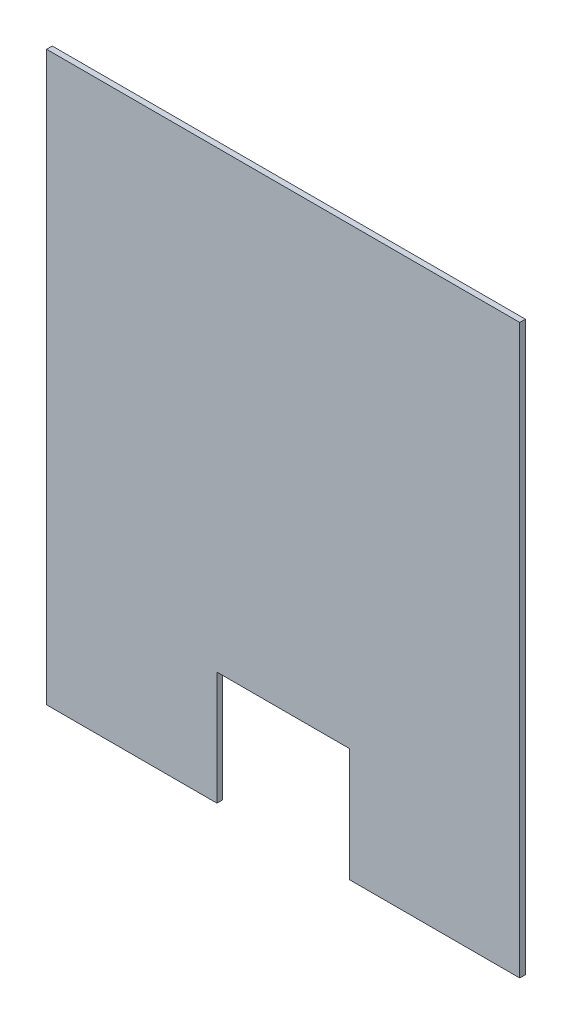
ISO-10303-21;
HEADER;
FILE_DESCRIPTION(('STEP AP214'),'2;1');
FILE_NAME('part.step','',(''),(''),'','','');
FILE_SCHEMA(('AUTOMOTIVE_DESIGN { 1 0 10303 214 1 1 1 1 }'));
ENDSEC;
DATA;
#1=APPLICATION_CONTEXT('core data for automotive mechanical design processes');
#2=APPLICATION_PROTOCOL_DEFINITION('international standard','automotive_design',2000,#1);
#3=PRODUCT_CONTEXT('',#1,'mechanical');
#4=PRODUCT('Part','Part','',(#3));
#5=PRODUCT_RELATED_PRODUCT_CATEGORY('part','',(#4));
#6=PRODUCT_DEFINITION_FORMATION('','',#4);
#7=PRODUCT_DEFINITION_CONTEXT('part definition',#1,'design');
#8=PRODUCT_DEFINITION('design','',#6,#7);
#9=PRODUCT_DEFINITION_SHAPE('','',#8);
#10=(LENGTH_UNIT() NAMED_UNIT(*) SI_UNIT(.MILLI.,.METRE.));
#11=(NAMED_UNIT(*) PLANE_ANGLE_UNIT() SI_UNIT($,.RADIAN.));
#12=(NAMED_UNIT(*) SI_UNIT($,.STERADIAN.) SOLID_ANGLE_UNIT());
#13=UNCERTAINTY_MEASURE_WITH_UNIT(LENGTH_MEASURE(1.E-05),#10,'distance_accuracy_value','');
#14=(GEOMETRIC_REPRESENTATION_CONTEXT(3) GLOBAL_UNCERTAINTY_ASSIGNED_CONTEXT((#13)) GLOBAL_UNIT_ASSIGNED_CONTEXT((#10,
#11,#12)) REPRESENTATION_CONTEXT('',''));
#15=CARTESIAN_POINT('',(0.,0.,0.));
#16=DIRECTION('',(0.,0.,1.));
#17=DIRECTION('',(1.,0.,0.));
#18=AXIS2_PLACEMENT_3D('',#15,#16,#17);
#19=CARTESIAN_POINT('',(125.,-150.,3.));
#20=DIRECTION('',(-1.,0.,0.));
#21=DIRECTION('',(0.,0.,1.));
#22=AXIS2_PLACEMENT_3D('',#19,#20,#21);
#23=PLANE('',#22);
#24=DIRECTION('',(0.,1.,0.));
#25=VECTOR('',#24,1.);
#26=CARTESIAN_POINT('',(125.,-150.,0.));
#27=LINE('',#26,#25);
#28=CARTESIAN_POINT('',(125.,-150.,0.));
#29=VERTEX_POINT('',#28);
#30=CARTESIAN_POINT('',(125.,150.,0.));
#31=VERTEX_POINT('',#30);
#32=EDGE_CURVE('E129',#29,#31,#27,.T.);
#33=ORIENTED_EDGE('',*,*,#32,.T.);
#34=DIRECTION('',(0.,0.,-1.));
#35=VECTOR('',#34,1.);
#36=CARTESIAN_POINT('',(125.,150.,3.));
#37=LINE('',#36,#35);
#38=CARTESIAN_POINT('',(125.,150.,3.));
#39=VERTEX_POINT('',#38);
#40=EDGE_CURVE('E11',#39,#31,#37,.T.);
#41=ORIENTED_EDGE('',*,*,#40,.F.);
#42=DIRECTION('',(0.,1.,0.));
#43=VECTOR('',#42,1.);
#44=CARTESIAN_POINT('',(125.,-150.,3.));
#45=LINE('',#44,#43);
#46=CARTESIAN_POINT('',(125.,-150.,3.));
#47=VERTEX_POINT('',#46);
#48=EDGE_CURVE('E143',#47,#39,#45,.T.);
#49=ORIENTED_EDGE('',*,*,#48,.F.);
#50=DIRECTION('',(0.,0.,-1.));
#51=VECTOR('',#50,1.);
#52=CARTESIAN_POINT('',(125.,-150.,3.));
#53=LINE('',#52,#51);
#54=EDGE_CURVE('E125',#47,#29,#53,.T.);
#55=ORIENTED_EDGE('',*,*,#54,.T.);
#56=EDGE_LOOP('',(#33,#41,#49,#55));
#57=FACE_BOUND('',#56,.T.);
#58=ADVANCED_FACE('F33',(#57),#23,.F.);
#59=CARTESIAN_POINT('',(-125.,150.,3.));
#60=DIRECTION('',(0.,-1.,0.));
#61=DIRECTION('',(0.,0.,-1.));
#62=AXIS2_PLACEMENT_3D('',#59,#60,#61);
#63=PLANE('',#62);
#64=DIRECTION('',(-1.,0.,0.));
#65=VECTOR('',#64,1.);
#66=CARTESIAN_POINT('',(-125.,150.,0.));
#67=LINE('',#66,#65);
#68=CARTESIAN_POINT('',(-125.,150.,0.));
#69=VERTEX_POINT('',#68);
#70=EDGE_CURVE('E132',#31,#69,#67,.T.);
#71=ORIENTED_EDGE('',*,*,#70,.T.);
#72=DIRECTION('',(0.,0.,-1.));
#73=VECTOR('',#72,1.);
#74=CARTESIAN_POINT('',(-125.,150.,3.));
#75=LINE('',#74,#73);
#76=CARTESIAN_POINT('',(-125.,150.,3.));
#77=VERTEX_POINT('',#76);
#78=EDGE_CURVE('E41',#77,#69,#75,.T.);
#79=ORIENTED_EDGE('',*,*,#78,.F.);
#80=DIRECTION('',(-1.,0.,0.));
#81=VECTOR('',#80,1.);
#82=CARTESIAN_POINT('',(-125.,150.,3.));
#83=LINE('',#82,#81);
#84=EDGE_CURVE('E92',#39,#77,#83,.T.);
#85=ORIENTED_EDGE('',*,*,#84,.F.);
#86=ORIENTED_EDGE('',*,*,#40,.T.);
#87=EDGE_LOOP('',(#71,#79,#85,#86));
#88=FACE_BOUND('',#87,.T.);
#89=ADVANCED_FACE('F178',(#88),#63,.F.);
#90=CARTESIAN_POINT('',(-125.,-150.,3.));
#91=DIRECTION('',(1.,0.,0.));
#92=DIRECTION('',(0.,0.,-1.));
#93=AXIS2_PLACEMENT_3D('',#90,#91,#92);
#94=PLANE('',#93);
#95=DIRECTION('',(0.,-1.,0.));
#96=VECTOR('',#95,1.);
#97=CARTESIAN_POINT('',(-125.,-150.,0.));
#98=LINE('',#97,#96);
#99=CARTESIAN_POINT('',(-125.,-150.,0.));
#100=VERTEX_POINT('',#99);
#101=EDGE_CURVE('E134',#69,#100,#98,.T.);
#102=ORIENTED_EDGE('',*,*,#101,.T.);
#103=DIRECTION('',(0.,0.,-1.));
#104=VECTOR('',#103,1.);
#105=CARTESIAN_POINT('',(-125.,-150.,3.));
#106=LINE('',#105,#104);
#107=CARTESIAN_POINT('',(-125.,-150.,3.));
#108=VERTEX_POINT('',#107);
#109=EDGE_CURVE('E150',#108,#100,#106,.T.);
#110=ORIENTED_EDGE('',*,*,#109,.F.);
#111=DIRECTION('',(0.,-1.,0.));
#112=VECTOR('',#111,1.);
#113=CARTESIAN_POINT('',(-125.,-150.,3.));
#114=LINE('',#113,#112);
#115=EDGE_CURVE('E158',#77,#108,#114,.T.);
#116=ORIENTED_EDGE('',*,*,#115,.F.);
#117=ORIENTED_EDGE('',*,*,#78,.T.);
#118=EDGE_LOOP('',(#102,#110,#116,#117));
#119=FACE_BOUND('',#118,.T.);
#120=ADVANCED_FACE('F156',(#119),#94,.F.);
#121=CARTESIAN_POINT('',(-125.,-150.,3.));
#122=DIRECTION('',(0.,1.,0.));
#123=DIRECTION('',(0.,0.,1.));
#124=AXIS2_PLACEMENT_3D('',#121,#122,#123);
#125=PLANE('',#124);
#126=DIRECTION('',(1.,0.,0.));
#127=VECTOR('',#126,1.);
#128=CARTESIAN_POINT('',(-125.,-150.,0.));
#129=LINE('',#128,#127);
#130=CARTESIAN_POINT('',(-35.,-150.,0.));
#131=VERTEX_POINT('',#130);
#132=EDGE_CURVE('E136',#100,#131,#129,.T.);
#133=ORIENTED_EDGE('',*,*,#132,.T.);
#134=DIRECTION('',(0.,0.,-1.));
#135=VECTOR('',#134,1.);
#136=CARTESIAN_POINT('',(-35.,-150.,3.));
#137=LINE('',#136,#135);
#138=CARTESIAN_POINT('',(-35.,-150.,3.));
#139=VERTEX_POINT('',#138);
#140=EDGE_CURVE('E147',#139,#131,#137,.T.);
#141=ORIENTED_EDGE('',*,*,#140,.F.);
#142=DIRECTION('',(1.,0.,0.));
#143=VECTOR('',#142,1.);
#144=CARTESIAN_POINT('',(-125.,-150.,3.));
#145=LINE('',#144,#143);
#146=EDGE_CURVE('E170',#108,#139,#145,.T.);
#147=ORIENTED_EDGE('',*,*,#146,.F.);
#148=ORIENTED_EDGE('',*,*,#109,.T.);
#149=EDGE_LOOP('',(#133,#141,#147,#148));
#150=FACE_BOUND('',#149,.T.);
#151=ADVANCED_FACE('F166',(#150),#125,.F.);
#152=CARTESIAN_POINT('',(-35.,-150.,3.));
#153=DIRECTION('',(-1.,0.,0.));
#154=DIRECTION('',(0.,-1.,0.));
#155=AXIS2_PLACEMENT_3D('',#152,#153,#154);
#156=PLANE('',#155);
#157=DIRECTION('',(0.,1.,0.));
#158=VECTOR('',#157,1.);
#159=CARTESIAN_POINT('',(-35.,-150.,0.));
#160=LINE('',#159,#158);
#161=CARTESIAN_POINT('',(-35.,-90.0000000000002,0.));
#162=VERTEX_POINT('',#161);
#163=EDGE_CURVE('E138',#131,#162,#160,.T.);
#164=ORIENTED_EDGE('',*,*,#163,.T.);
#165=DIRECTION('',(0.,0.,-1.));
#166=VECTOR('',#165,1.);
#167=CARTESIAN_POINT('',(-35.,-90.0000000000002,3.));
#168=LINE('',#167,#166);
#169=CARTESIAN_POINT('',(-35.,-90.0000000000002,3.));
#170=VERTEX_POINT('',#169);
#171=EDGE_CURVE('E120',#170,#162,#168,.T.);
#172=ORIENTED_EDGE('',*,*,#171,.F.);
#173=DIRECTION('',(0.,1.,0.));
#174=VECTOR('',#173,1.);
#175=CARTESIAN_POINT('',(-35.,-150.,3.));
#176=LINE('',#175,#174);
#177=EDGE_CURVE('E111',#139,#170,#176,.T.);
#178=ORIENTED_EDGE('',*,*,#177,.F.);
#179=ORIENTED_EDGE('',*,*,#140,.T.);
#180=EDGE_LOOP('',(#164,#172,#178,#179));
#181=FACE_BOUND('',#180,.T.);
#182=ADVANCED_FACE('F169',(#181),#156,.F.);
#183=CARTESIAN_POINT('',(-35.,-90.0000000000002,3.));
#184=DIRECTION('',(0.,1.,0.));
#185=DIRECTION('',(0.,0.,1.));
#186=AXIS2_PLACEMENT_3D('',#183,#184,#185);
#187=PLANE('',#186);
#188=DIRECTION('',(1.,0.,0.));
#189=VECTOR('',#188,1.);
#190=CARTESIAN_POINT('',(-35.,-90.0000000000002,0.));
#191=LINE('',#190,#189);
#192=CARTESIAN_POINT('',(35.,-90.0000000000002,0.));
#193=VERTEX_POINT('',#192);
#194=EDGE_CURVE('E119',#162,#193,#191,.T.);
#195=ORIENTED_EDGE('',*,*,#194,.T.);
#196=DIRECTION('',(0.,0.,-1.));
#197=VECTOR('',#196,1.);
#198=CARTESIAN_POINT('',(35.,-90.0000000000002,3.));
#199=LINE('',#198,#197);
#200=CARTESIAN_POINT('',(35.,-90.0000000000002,3.));
#201=VERTEX_POINT('',#200);
#202=EDGE_CURVE('E116',#201,#193,#199,.T.);
#203=ORIENTED_EDGE('',*,*,#202,.F.);
#204=DIRECTION('',(1.,0.,0.));
#205=VECTOR('',#204,1.);
#206=CARTESIAN_POINT('',(-35.,-90.0000000000002,3.));
#207=LINE('',#206,#205);
#208=EDGE_CURVE('E105',#170,#201,#207,.T.);
#209=ORIENTED_EDGE('',*,*,#208,.F.);
#210=ORIENTED_EDGE('',*,*,#171,.T.);
#211=EDGE_LOOP('',(#195,#203,#209,#210));
#212=FACE_BOUND('',#211,.T.);
#213=ADVANCED_FACE('F117',(#212),#187,.F.);
#214=CARTESIAN_POINT('',(35.,-150.,3.));
#215=DIRECTION('',(1.,0.,0.));
#216=DIRECTION('',(0.,1.,0.));
#217=AXIS2_PLACEMENT_3D('',#214,#215,#216);
#218=PLANE('',#217);
#219=DIRECTION('',(0.,-1.,0.));
#220=VECTOR('',#219,1.);
#221=CARTESIAN_POINT('',(35.,-150.,0.));
#222=LINE('',#221,#220);
#223=CARTESIAN_POINT('',(35.,-150.,0.));
#224=VERTEX_POINT('',#223);
#225=EDGE_CURVE('E78',#193,#224,#222,.T.);
#226=ORIENTED_EDGE('',*,*,#225,.T.);
#227=DIRECTION('',(0.,0.,-1.));
#228=VECTOR('',#227,1.);
#229=CARTESIAN_POINT('',(35.,-150.,3.));
#230=LINE('',#229,#228);
#231=CARTESIAN_POINT('',(35.,-150.,3.));
#232=VERTEX_POINT('',#231);
#233=EDGE_CURVE('E121',#232,#224,#230,.T.);
#234=ORIENTED_EDGE('',*,*,#233,.F.);
#235=DIRECTION('',(0.,-1.,0.));
#236=VECTOR('',#235,1.);
#237=CARTESIAN_POINT('',(35.,-150.,3.));
#238=LINE('',#237,#236);
#239=EDGE_CURVE('E109',#201,#232,#238,.T.);
#240=ORIENTED_EDGE('',*,*,#239,.F.);
#241=ORIENTED_EDGE('',*,*,#202,.T.);
#242=EDGE_LOOP('',(#226,#234,#240,#241));
#243=FACE_BOUND('',#242,.T.);
#244=ADVANCED_FACE('F123',(#243),#218,.F.);
#245=CARTESIAN_POINT('',(35.,-150.,3.));
#246=DIRECTION('',(0.,1.,0.));
#247=DIRECTION('',(0.,0.,1.));
#248=AXIS2_PLACEMENT_3D('',#245,#246,#247);
#249=PLANE('',#248);
#250=DIRECTION('',(1.,0.,0.));
#251=VECTOR('',#250,1.);
#252=CARTESIAN_POINT('',(35.,-150.,0.));
#253=LINE('',#252,#251);
#254=EDGE_CURVE('E84',#224,#29,#253,.T.);
#255=ORIENTED_EDGE('',*,*,#254,.T.);
#256=ORIENTED_EDGE('',*,*,#54,.F.);
#257=DIRECTION('',(1.,0.,0.));
#258=VECTOR('',#257,1.);
#259=CARTESIAN_POINT('',(35.,-150.,3.));
#260=LINE('',#259,#258);
#261=EDGE_CURVE('E49',#232,#47,#260,.T.);
#262=ORIENTED_EDGE('',*,*,#261,.F.);
#263=ORIENTED_EDGE('',*,*,#233,.T.);
#264=EDGE_LOOP('',(#255,#256,#262,#263));
#265=FACE_BOUND('',#264,.T.);
#266=ADVANCED_FACE('F194',(#265),#249,.F.);
#267=CARTESIAN_POINT('',(0.,0.,3.));
#268=DIRECTION('',(0.,0.,-1.));
#269=DIRECTION('',(-1.,0.,0.));
#270=AXIS2_PLACEMENT_3D('',#267,#268,#269);
#271=PLANE('',#270);
#272=ORIENTED_EDGE('',*,*,#48,.T.);
#273=ORIENTED_EDGE('',*,*,#84,.T.);
#274=ORIENTED_EDGE('',*,*,#115,.T.);
#275=ORIENTED_EDGE('',*,*,#146,.T.);
#276=ORIENTED_EDGE('',*,*,#177,.T.);
#277=ORIENTED_EDGE('',*,*,#208,.T.);
#278=ORIENTED_EDGE('',*,*,#239,.T.);
#279=ORIENTED_EDGE('',*,*,#261,.T.);
#280=EDGE_LOOP('',(#272,#273,#274,#275,#276,#277,#278,#279));
#281=FACE_BOUND('',#280,.T.);
#282=ADVANCED_FACE('F107',(#281),#271,.F.);
#283=CARTESIAN_POINT('',(0.,0.,0.));
#284=DIRECTION('',(0.,0.,-1.));
#285=DIRECTION('',(-1.,0.,0.));
#286=AXIS2_PLACEMENT_3D('',#283,#284,#285);
#287=PLANE('',#286);
#288=ORIENTED_EDGE('',*,*,#32,.F.);
#289=ORIENTED_EDGE('',*,*,#254,.F.);
#290=ORIENTED_EDGE('',*,*,#225,.F.);
#291=ORIENTED_EDGE('',*,*,#194,.F.);
#292=ORIENTED_EDGE('',*,*,#163,.F.);
#293=ORIENTED_EDGE('',*,*,#132,.F.);
#294=ORIENTED_EDGE('',*,*,#101,.F.);
#295=ORIENTED_EDGE('',*,*,#70,.F.);
#296=EDGE_LOOP('',(#288,#289,#290,#291,#292,#293,#294,#295));
#297=FACE_BOUND('',#296,.T.);
#298=ADVANCED_FACE('F162',(#297),#287,.T.);
#299=CLOSED_SHELL('',(#58,#89,#120,#151,#182,#213,#244,#266,#282,#298));
#300=MANIFOLD_SOLID_BREP('B2',#299);
#301=ADVANCED_BREP_SHAPE_REPRESENTATION('',(#18,#300),#14);
#302=SHAPE_DEFINITION_REPRESENTATION(#9,#301);
ENDSEC;
END-ISO-10303-21;
